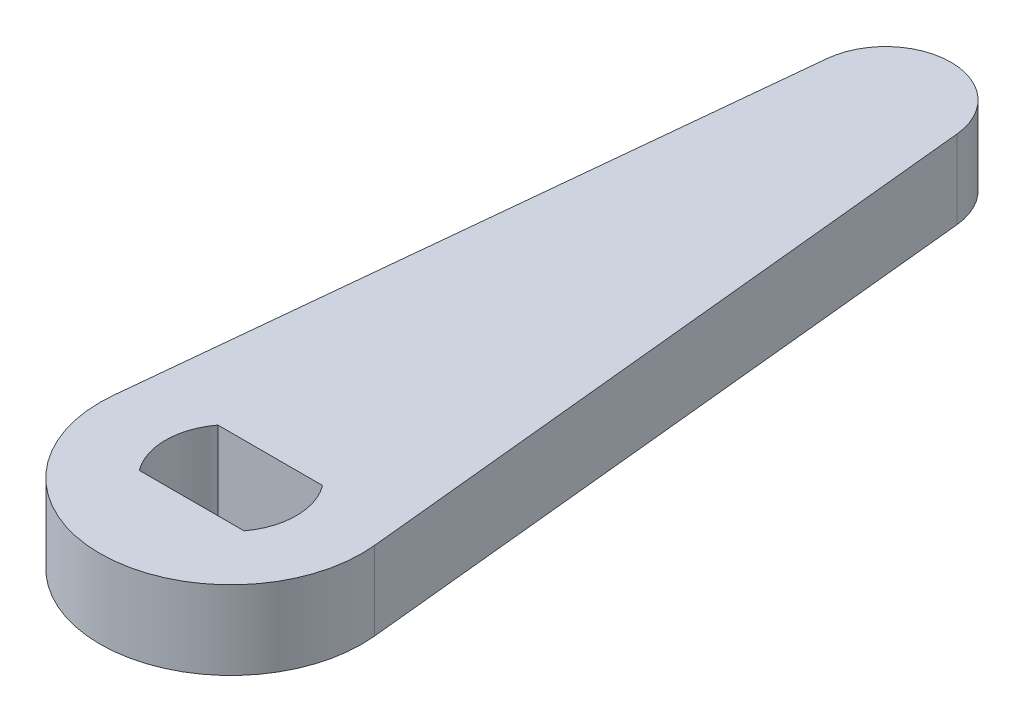
ISO-10303-21;
HEADER;
FILE_DESCRIPTION(('STEP AP214'),'2;1');
FILE_NAME('part.step','',(''),(''),'','','');
FILE_SCHEMA(('AUTOMOTIVE_DESIGN { 1 0 10303 214 1 1 1 1 }'));
ENDSEC;
DATA;
#1=APPLICATION_CONTEXT('core data for automotive mechanical design processes');
#2=APPLICATION_PROTOCOL_DEFINITION('international standard','automotive_design',2000,#1);
#3=PRODUCT_CONTEXT('',#1,'mechanical');
#4=PRODUCT('Part','Part','',(#3));
#5=PRODUCT_RELATED_PRODUCT_CATEGORY('part','',(#4));
#6=PRODUCT_DEFINITION_FORMATION('','',#4);
#7=PRODUCT_DEFINITION_CONTEXT('part definition',#1,'design');
#8=PRODUCT_DEFINITION('design','',#6,#7);
#9=PRODUCT_DEFINITION_SHAPE('','',#8);
#10=(LENGTH_UNIT() NAMED_UNIT(*) SI_UNIT(.MILLI.,.METRE.));
#11=(NAMED_UNIT(*) PLANE_ANGLE_UNIT() SI_UNIT($,.RADIAN.));
#12=(NAMED_UNIT(*) SI_UNIT($,.STERADIAN.) SOLID_ANGLE_UNIT());
#13=UNCERTAINTY_MEASURE_WITH_UNIT(LENGTH_MEASURE(1.E-05),#10,'distance_accuracy_value','');
#14=(GEOMETRIC_REPRESENTATION_CONTEXT(3) GLOBAL_UNCERTAINTY_ASSIGNED_CONTEXT((#13)) GLOBAL_UNIT_ASSIGNED_CONTEXT((#10,
#11,#12)) REPRESENTATION_CONTEXT('',''));
#15=CARTESIAN_POINT('',(0.,0.,0.));
#16=DIRECTION('',(0.,0.,1.));
#17=DIRECTION('',(1.,0.,0.));
#18=AXIS2_PLACEMENT_3D('',#15,#16,#17);
#19=CARTESIAN_POINT('',(0.,3.,0.));
#20=DIRECTION('',(0.,1.,0.));
#21=DIRECTION('',(0.,0.,1.));
#22=AXIS2_PLACEMENT_3D('',#19,#20,#21);
#23=PLANE('',#22);
#24=CARTESIAN_POINT('',(0.,3.,0.));
#25=DIRECTION('',(0.,1.,0.));
#26=DIRECTION('',(0.,0.,1.));
#27=AXIS2_PLACEMENT_3D('',#24,#25,#26);
#28=CIRCLE('',#27,5.);
#29=CARTESIAN_POINT('',(-4.9749371855331,3.,-0.5));
#30=VERTEX_POINT('',#29);
#31=CARTESIAN_POINT('',(4.9749371855331,3.,-0.5));
#32=VERTEX_POINT('',#31);
#33=EDGE_CURVE('E169',#30,#32,#28,.T.);
#34=ORIENTED_EDGE('',*,*,#33,.T.);
#35=DIRECTION('',(-0.1,0.,-0.99498743710662));
#36=VECTOR('',#35,1.);
#37=CARTESIAN_POINT('',(4.9749371855331,3.,-0.5));
#38=LINE('',#37,#36);
#39=CARTESIAN_POINT('',(2.48746859276655,3.,-25.25));
#40=VERTEX_POINT('',#39);
#41=EDGE_CURVE('E173',#32,#40,#38,.T.);
#42=ORIENTED_EDGE('',*,*,#41,.T.);
#43=CARTESIAN_POINT('',(0.,3.,-25.));
#44=DIRECTION('',(0.,1.,0.));
#45=DIRECTION('',(0.,0.,1.));
#46=AXIS2_PLACEMENT_3D('',#43,#44,#45);
#47=CIRCLE('',#46,2.5);
#48=CARTESIAN_POINT('',(-2.48746859276655,3.,-25.25));
#49=VERTEX_POINT('',#48);
#50=EDGE_CURVE('E177',#40,#49,#47,.T.);
#51=ORIENTED_EDGE('',*,*,#50,.T.);
#52=DIRECTION('',(-0.1,0.,0.99498743710662));
#53=VECTOR('',#52,1.);
#54=CARTESIAN_POINT('',(-4.9749371855331,3.,-0.5));
#55=LINE('',#54,#53);
#56=EDGE_CURVE('E180',#49,#30,#55,.T.);
#57=ORIENTED_EDGE('',*,*,#56,.T.);
#58=EDGE_LOOP('',(#34,#42,#51,#57));
#59=FACE_BOUND('',#58,.T.);
#60=DIRECTION('',(1.,0.,0.));
#61=VECTOR('',#60,1.);
#62=CARTESIAN_POINT('',(-2.,3.,1.5));
#63=LINE('',#62,#61);
#64=CARTESIAN_POINT('',(-2.,3.,1.5));
#65=VERTEX_POINT('',#64);
#66=CARTESIAN_POINT('',(2.,3.,1.5));
#67=VERTEX_POINT('',#66);
#68=EDGE_CURVE('E130',#65,#67,#63,.T.);
#69=ORIENTED_EDGE('',*,*,#68,.F.);
#70=CARTESIAN_POINT('',(0.,3.,0.));
#71=DIRECTION('',(0.,1.,0.));
#72=DIRECTION('',(0.,0.,1.));
#73=AXIS2_PLACEMENT_3D('',#70,#71,#72);
#74=CIRCLE('',#73,2.5);
#75=CARTESIAN_POINT('',(-2.,3.,-1.5));
#76=VERTEX_POINT('',#75);
#77=EDGE_CURVE('E121',#76,#65,#74,.T.);
#78=ORIENTED_EDGE('',*,*,#77,.F.);
#79=DIRECTION('',(-1.,0.,0.));
#80=VECTOR('',#79,1.);
#81=CARTESIAN_POINT('',(-2.,3.,-1.5));
#82=LINE('',#81,#80);
#83=CARTESIAN_POINT('',(2.,3.,-1.5));
#84=VERTEX_POINT('',#83);
#85=EDGE_CURVE('E147',#84,#76,#82,.T.);
#86=ORIENTED_EDGE('',*,*,#85,.F.);
#87=CARTESIAN_POINT('',(0.,3.,0.));
#88=DIRECTION('',(0.,1.,0.));
#89=DIRECTION('',(0.,0.,1.));
#90=AXIS2_PLACEMENT_3D('',#87,#88,#89);
#91=CIRCLE('',#90,2.5);
#92=EDGE_CURVE('E143',#67,#84,#91,.T.);
#93=ORIENTED_EDGE('',*,*,#92,.F.);
#94=EDGE_LOOP('',(#69,#78,#86,#93));
#95=FACE_BOUND('',#94,.T.);
#96=ADVANCED_FACE('F43',(#59,#95),#23,.T.);
#97=CARTESIAN_POINT('',(0.,0.,0.));
#98=DIRECTION('',(0.,1.,0.));
#99=DIRECTION('',(0.,0.,1.));
#100=AXIS2_PLACEMENT_3D('',#97,#98,#99);
#101=PLANE('',#100);
#102=CARTESIAN_POINT('',(0.,0.,0.));
#103=DIRECTION('',(0.,1.,0.));
#104=DIRECTION('',(0.,0.,1.));
#105=AXIS2_PLACEMENT_3D('',#102,#103,#104);
#106=CIRCLE('',#105,5.);
#107=CARTESIAN_POINT('',(-4.9749371855331,0.,-0.5));
#108=VERTEX_POINT('',#107);
#109=CARTESIAN_POINT('',(4.9749371855331,0.,-0.5));
#110=VERTEX_POINT('',#109);
#111=EDGE_CURVE('E139',#108,#110,#106,.T.);
#112=ORIENTED_EDGE('',*,*,#111,.F.);
#113=DIRECTION('',(-0.1,0.,0.99498743710662));
#114=VECTOR('',#113,1.);
#115=CARTESIAN_POINT('',(-4.9749371855331,0.,-0.5));
#116=LINE('',#115,#114);
#117=CARTESIAN_POINT('',(-2.48746859276655,0.,-25.25));
#118=VERTEX_POINT('',#117);
#119=EDGE_CURVE('E174',#118,#108,#116,.T.);
#120=ORIENTED_EDGE('',*,*,#119,.F.);
#121=CARTESIAN_POINT('',(0.,0.,-25.));
#122=DIRECTION('',(0.,1.,0.));
#123=DIRECTION('',(0.,0.,1.));
#124=AXIS2_PLACEMENT_3D('',#121,#122,#123);
#125=CIRCLE('',#124,2.5);
#126=CARTESIAN_POINT('',(2.48746859276655,0.,-25.25));
#127=VERTEX_POINT('',#126);
#128=EDGE_CURVE('E190',#127,#118,#125,.T.);
#129=ORIENTED_EDGE('',*,*,#128,.F.);
#130=DIRECTION('',(-0.1,0.,-0.99498743710662));
#131=VECTOR('',#130,1.);
#132=CARTESIAN_POINT('',(4.9749371855331,0.,-0.5));
#133=LINE('',#132,#131);
#134=EDGE_CURVE('E187',#110,#127,#133,.T.);
#135=ORIENTED_EDGE('',*,*,#134,.F.);
#136=EDGE_LOOP('',(#112,#120,#129,#135));
#137=FACE_BOUND('',#136,.T.);
#138=CARTESIAN_POINT('',(0.,0.,0.));
#139=DIRECTION('',(0.,1.,0.));
#140=DIRECTION('',(0.,0.,1.));
#141=AXIS2_PLACEMENT_3D('',#138,#139,#140);
#142=CIRCLE('',#141,2.5);
#143=CARTESIAN_POINT('',(-2.,0.,-1.5));
#144=VERTEX_POINT('',#143);
#145=CARTESIAN_POINT('',(-2.,0.,1.5));
#146=VERTEX_POINT('',#145);
#147=EDGE_CURVE('E70',#144,#146,#142,.T.);
#148=ORIENTED_EDGE('',*,*,#147,.T.);
#149=DIRECTION('',(1.,0.,0.));
#150=VECTOR('',#149,1.);
#151=CARTESIAN_POINT('',(-2.,0.,1.5));
#152=LINE('',#151,#150);
#153=CARTESIAN_POINT('',(2.,0.,1.5));
#154=VERTEX_POINT('',#153);
#155=EDGE_CURVE('E137',#146,#154,#152,.T.);
#156=ORIENTED_EDGE('',*,*,#155,.T.);
#157=CARTESIAN_POINT('',(0.,0.,0.));
#158=DIRECTION('',(0.,1.,0.));
#159=DIRECTION('',(0.,0.,1.));
#160=AXIS2_PLACEMENT_3D('',#157,#158,#159);
#161=CIRCLE('',#160,2.5);
#162=CARTESIAN_POINT('',(2.,0.,-1.5));
#163=VERTEX_POINT('',#162);
#164=EDGE_CURVE('E156',#154,#163,#161,.T.);
#165=ORIENTED_EDGE('',*,*,#164,.T.);
#166=DIRECTION('',(-1.,0.,0.));
#167=VECTOR('',#166,1.);
#168=CARTESIAN_POINT('',(-2.,0.,-1.5));
#169=LINE('',#168,#167);
#170=EDGE_CURVE('E131',#163,#144,#169,.T.);
#171=ORIENTED_EDGE('',*,*,#170,.T.);
#172=EDGE_LOOP('',(#148,#156,#165,#171));
#173=FACE_BOUND('',#172,.T.);
#174=ADVANCED_FACE('F213',(#137,#173),#101,.F.);
#175=CARTESIAN_POINT('',(0.,3.,0.));
#176=DIRECTION('',(0.,-1.,0.));
#177=DIRECTION('',(0.,0.,-1.));
#178=AXIS2_PLACEMENT_3D('',#175,#176,#177);
#179=CYLINDRICAL_SURFACE('',#178,5.);
#180=ORIENTED_EDGE('',*,*,#111,.T.);
#181=DIRECTION('',(0.,-1.,0.));
#182=VECTOR('',#181,1.);
#183=CARTESIAN_POINT('',(4.9749371855331,3.,-0.5));
#184=LINE('',#183,#182);
#185=EDGE_CURVE('E11',#32,#110,#184,.T.);
#186=ORIENTED_EDGE('',*,*,#185,.F.);
#187=ORIENTED_EDGE('',*,*,#33,.F.);
#188=DIRECTION('',(0.,-1.,0.));
#189=VECTOR('',#188,1.);
#190=CARTESIAN_POINT('',(-4.9749371855331,3.,-0.5));
#191=LINE('',#190,#189);
#192=EDGE_CURVE('E183',#30,#108,#191,.T.);
#193=ORIENTED_EDGE('',*,*,#192,.T.);
#194=EDGE_LOOP('',(#180,#186,#187,#193));
#195=FACE_BOUND('',#194,.T.);
#196=ADVANCED_FACE('F45',(#195),#179,.T.);
#197=CARTESIAN_POINT('',(4.9749371855331,3.,-0.5));
#198=DIRECTION('',(-0.99498743710662,0.,0.1));
#199=DIRECTION('',(0.1,0.,0.99498743710662));
#200=AXIS2_PLACEMENT_3D('',#197,#198,#199);
#201=PLANE('',#200);
#202=ORIENTED_EDGE('',*,*,#134,.T.);
#203=DIRECTION('',(0.,-1.,0.));
#204=VECTOR('',#203,1.);
#205=CARTESIAN_POINT('',(2.48746859276655,3.,-25.25));
#206=LINE('',#205,#204);
#207=EDGE_CURVE('E52',#40,#127,#206,.T.);
#208=ORIENTED_EDGE('',*,*,#207,.F.);
#209=ORIENTED_EDGE('',*,*,#41,.F.);
#210=ORIENTED_EDGE('',*,*,#185,.T.);
#211=EDGE_LOOP('',(#202,#208,#209,#210));
#212=FACE_BOUND('',#211,.T.);
#213=ADVANCED_FACE('F223',(#212),#201,.F.);
#214=CARTESIAN_POINT('',(0.,3.,-25.));
#215=DIRECTION('',(0.,-1.,0.));
#216=DIRECTION('',(0.,0.,-1.));
#217=AXIS2_PLACEMENT_3D('',#214,#215,#216);
#218=CYLINDRICAL_SURFACE('',#217,2.5);
#219=ORIENTED_EDGE('',*,*,#128,.T.);
#220=DIRECTION('',(0.,-1.,0.));
#221=VECTOR('',#220,1.);
#222=CARTESIAN_POINT('',(-2.48746859276655,3.,-25.25));
#223=LINE('',#222,#221);
#224=EDGE_CURVE('E198',#49,#118,#223,.T.);
#225=ORIENTED_EDGE('',*,*,#224,.F.);
#226=ORIENTED_EDGE('',*,*,#50,.F.);
#227=ORIENTED_EDGE('',*,*,#207,.T.);
#228=EDGE_LOOP('',(#219,#225,#226,#227));
#229=FACE_BOUND('',#228,.T.);
#230=ADVANCED_FACE('F207',(#229),#218,.T.);
#231=CARTESIAN_POINT('',(-4.9749371855331,3.,-0.5));
#232=DIRECTION('',(0.99498743710662,0.,0.1));
#233=DIRECTION('',(0.1,0.,-0.99498743710662));
#234=AXIS2_PLACEMENT_3D('',#231,#232,#233);
#235=PLANE('',#234);
#236=ORIENTED_EDGE('',*,*,#119,.T.);
#237=ORIENTED_EDGE('',*,*,#192,.F.);
#238=ORIENTED_EDGE('',*,*,#56,.F.);
#239=ORIENTED_EDGE('',*,*,#224,.T.);
#240=EDGE_LOOP('',(#236,#237,#238,#239));
#241=FACE_BOUND('',#240,.T.);
#242=ADVANCED_FACE('F217',(#241),#235,.F.);
#243=CARTESIAN_POINT('',(0.,3.,0.));
#244=DIRECTION('',(0.,-1.,0.));
#245=DIRECTION('',(0.,0.,-1.));
#246=AXIS2_PLACEMENT_3D('',#243,#244,#245);
#247=CYLINDRICAL_SURFACE('',#246,2.5);
#248=ORIENTED_EDGE('',*,*,#147,.F.);
#249=DIRECTION('',(0.,-1.,0.));
#250=VECTOR('',#249,1.);
#251=CARTESIAN_POINT('',(-2.,3.,-1.5));
#252=LINE('',#251,#250);
#253=EDGE_CURVE('E125',#76,#144,#252,.T.);
#254=ORIENTED_EDGE('',*,*,#253,.F.);
#255=ORIENTED_EDGE('',*,*,#77,.T.);
#256=DIRECTION('',(0.,-1.,0.));
#257=VECTOR('',#256,1.);
#258=CARTESIAN_POINT('',(-2.,3.,1.5));
#259=LINE('',#258,#257);
#260=EDGE_CURVE('E124',#65,#146,#259,.T.);
#261=ORIENTED_EDGE('',*,*,#260,.T.);
#262=EDGE_LOOP('',(#248,#254,#255,#261));
#263=FACE_BOUND('',#262,.T.);
#264=ADVANCED_FACE('F123',(#263),#247,.F.);
#265=CARTESIAN_POINT('',(-2.,3.,1.5));
#266=DIRECTION('',(0.,0.,-1.));
#267=DIRECTION('',(-1.,0.,0.));
#268=AXIS2_PLACEMENT_3D('',#265,#266,#267);
#269=PLANE('',#268);
#270=ORIENTED_EDGE('',*,*,#155,.F.);
#271=ORIENTED_EDGE('',*,*,#260,.F.);
#272=ORIENTED_EDGE('',*,*,#68,.T.);
#273=DIRECTION('',(0.,-1.,0.));
#274=VECTOR('',#273,1.);
#275=CARTESIAN_POINT('',(2.,3.,1.5));
#276=LINE('',#275,#274);
#277=EDGE_CURVE('E140',#67,#154,#276,.T.);
#278=ORIENTED_EDGE('',*,*,#277,.T.);
#279=EDGE_LOOP('',(#270,#271,#272,#278));
#280=FACE_BOUND('',#279,.T.);
#281=ADVANCED_FACE('F134',(#280),#269,.T.);
#282=CARTESIAN_POINT('',(0.,3.,0.));
#283=DIRECTION('',(0.,-1.,0.));
#284=DIRECTION('',(0.,0.,-1.));
#285=AXIS2_PLACEMENT_3D('',#282,#283,#284);
#286=CYLINDRICAL_SURFACE('',#285,2.5);
#287=ORIENTED_EDGE('',*,*,#164,.F.);
#288=ORIENTED_EDGE('',*,*,#277,.F.);
#289=ORIENTED_EDGE('',*,*,#92,.T.);
#290=DIRECTION('',(0.,-1.,0.));
#291=VECTOR('',#290,1.);
#292=CARTESIAN_POINT('',(2.,3.,-1.5));
#293=LINE('',#292,#291);
#294=EDGE_CURVE('E62',#84,#163,#293,.T.);
#295=ORIENTED_EDGE('',*,*,#294,.T.);
#296=EDGE_LOOP('',(#287,#288,#289,#295));
#297=FACE_BOUND('',#296,.T.);
#298=ADVANCED_FACE('F246',(#297),#286,.F.);
#299=CARTESIAN_POINT('',(-2.,3.,-1.5));
#300=DIRECTION('',(0.,0.,1.));
#301=DIRECTION('',(1.,0.,0.));
#302=AXIS2_PLACEMENT_3D('',#299,#300,#301);
#303=PLANE('',#302);
#304=ORIENTED_EDGE('',*,*,#170,.F.);
#305=ORIENTED_EDGE('',*,*,#294,.F.);
#306=ORIENTED_EDGE('',*,*,#85,.T.);
#307=ORIENTED_EDGE('',*,*,#253,.T.);
#308=EDGE_LOOP('',(#304,#305,#306,#307));
#309=FACE_BOUND('',#308,.T.);
#310=ADVANCED_FACE('F250',(#309),#303,.T.);
#311=CLOSED_SHELL('',(#96,#174,#196,#213,#230,#242,#264,#281,#298,#310));
#312=MANIFOLD_SOLID_BREP('B2',#311);
#313=ADVANCED_BREP_SHAPE_REPRESENTATION('',(#18,#312),#14);
#314=SHAPE_DEFINITION_REPRESENTATION(#9,#313);
ENDSEC;
END-ISO-10303-21;
